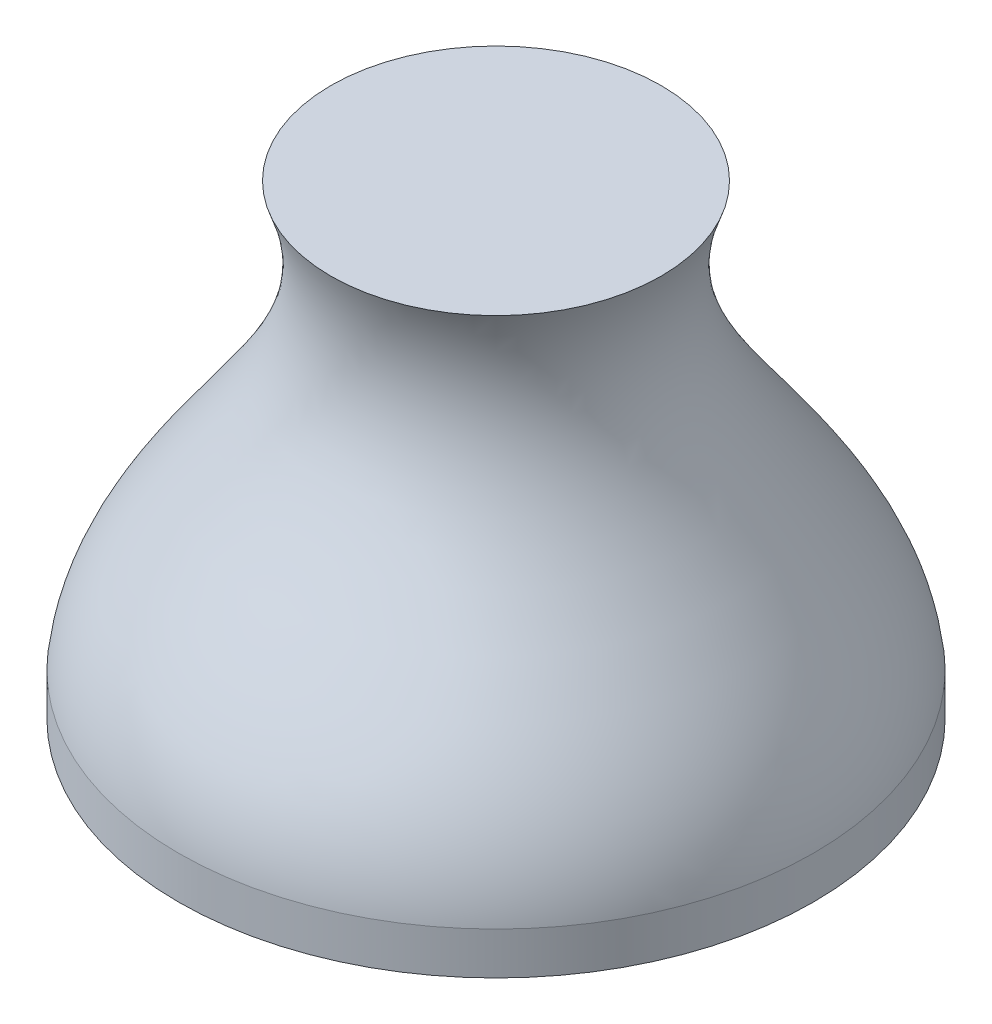
ISO-10303-21;
HEADER;
FILE_DESCRIPTION(('STEP AP214'),'2;1');
FILE_NAME('part.step','',(''),(''),'','','');
FILE_SCHEMA(('AUTOMOTIVE_DESIGN { 1 0 10303 214 1 1 1 1 }'));
ENDSEC;
DATA;
#1=APPLICATION_CONTEXT('core data for automotive mechanical design processes');
#2=APPLICATION_PROTOCOL_DEFINITION('international standard','automotive_design',2000,#1);
#3=PRODUCT_CONTEXT('',#1,'mechanical');
#4=PRODUCT('Part','Part','',(#3));
#5=PRODUCT_RELATED_PRODUCT_CATEGORY('part','',(#4));
#6=PRODUCT_DEFINITION_FORMATION('','',#4);
#7=PRODUCT_DEFINITION_CONTEXT('part definition',#1,'design');
#8=PRODUCT_DEFINITION('design','',#6,#7);
#9=PRODUCT_DEFINITION_SHAPE('','',#8);
#10=(LENGTH_UNIT() NAMED_UNIT(*) SI_UNIT(.MILLI.,.METRE.));
#11=(NAMED_UNIT(*) PLANE_ANGLE_UNIT() SI_UNIT($,.RADIAN.));
#12=(NAMED_UNIT(*) SI_UNIT($,.STERADIAN.) SOLID_ANGLE_UNIT());
#13=UNCERTAINTY_MEASURE_WITH_UNIT(LENGTH_MEASURE(1.E-05),#10,'distance_accuracy_value','');
#14=(GEOMETRIC_REPRESENTATION_CONTEXT(3) GLOBAL_UNCERTAINTY_ASSIGNED_CONTEXT((#13)) GLOBAL_UNIT_ASSIGNED_CONTEXT((#10,
#11,#12)) REPRESENTATION_CONTEXT('',''));
#15=CARTESIAN_POINT('',(0.,0.,0.));
#16=DIRECTION('',(0.,0.,1.));
#17=DIRECTION('',(1.,0.,0.));
#18=AXIS2_PLACEMENT_3D('',#15,#16,#17);
#19=CARTESIAN_POINT('',(0.,20.,0.));
#20=DIRECTION('',(0.,1.,0.));
#21=DIRECTION('',(0.,0.,1.));
#22=AXIS2_PLACEMENT_3D('',#19,#20,#21);
#23=PLANE('',#22);
#24=CARTESIAN_POINT('',(0.,20.,0.));
#25=DIRECTION('',(0.,-1.,0.));
#26=DIRECTION('',(0.,0.,-1.));
#27=AXIS2_PLACEMENT_3D('',#24,#25,#26);
#28=CIRCLE('',#27,7.79946678747429);
#29=CARTESIAN_POINT('',(0.,20.,-7.79946678747429));
#30=VERTEX_POINT('',#29);
#31=EDGE_CURVE('E10',#30,#30,#28,.T.);
#32=ORIENTED_EDGE('',*,*,#31,.F.);
#33=EDGE_LOOP('',(#32));
#34=FACE_BOUND('',#33,.T.);
#35=ADVANCED_FACE('F43',(#34),#23,.T.);
#36=CARTESIAN_POINT('',(15.,0.,0.));
#37=CARTESIAN_POINT('',(14.1432791096964,7.42030353401986,0.));
#38=CARTESIAN_POINT('',(4.50256170609478,11.6925361738555,0.));
#39=CARTESIAN_POINT('',(7.79946678747429,20.,0.));
#40=B_SPLINE_CURVE_WITH_KNOTS('',3,(#36,#37,#38,#39),.UNSPECIFIED.,.F.,.F.,(4,4),(0.,1.),.UNSPECIFIED.);
#41=CARTESIAN_POINT('',(0.,0.,0.));
#42=DIRECTION('',(0.,-1.,0.));
#43=AXIS1_PLACEMENT('',#41,#42);
#44=SURFACE_OF_REVOLUTION('',#40,#43);
#45=ORIENTED_EDGE('',*,*,#31,.T.);
#46=EDGE_LOOP('',(#45));
#47=FACE_BOUND('',#46,.T.);
#48=CARTESIAN_POINT('',(0.,0.,0.));
#49=DIRECTION('',(0.,-1.,0.));
#50=DIRECTION('',(0.,0.,-1.));
#51=AXIS2_PLACEMENT_3D('',#48,#49,#50);
#52=CIRCLE('',#51,15.);
#53=CARTESIAN_POINT('',(0.,0.,-15.));
#54=VERTEX_POINT('',#53);
#55=EDGE_CURVE('E50',#54,#54,#52,.T.);
#56=ORIENTED_EDGE('',*,*,#55,.F.);
#57=EDGE_LOOP('',(#56));
#58=FACE_BOUND('',#57,.T.);
#59=ADVANCED_FACE('F68',(#47,#58),#44,.F.);
#60=CARTESIAN_POINT('',(0.,-2.,0.));
#61=DIRECTION('',(0.,1.,0.));
#62=DIRECTION('',(0.,0.,1.));
#63=AXIS2_PLACEMENT_3D('',#60,#61,#62);
#64=CYLINDRICAL_SURFACE('',#63,15.);
#65=CARTESIAN_POINT('',(0.,-2.,0.));
#66=DIRECTION('',(0.,-1.,0.));
#67=DIRECTION('',(0.,0.,-1.));
#68=AXIS2_PLACEMENT_3D('',#65,#66,#67);
#69=CIRCLE('',#68,15.);
#70=CARTESIAN_POINT('',(0.,-2.,-15.));
#71=VERTEX_POINT('',#70);
#72=EDGE_CURVE('E55',#71,#71,#69,.T.);
#73=ORIENTED_EDGE('',*,*,#72,.F.);
#74=EDGE_LOOP('',(#73));
#75=FACE_BOUND('',#74,.T.);
#76=ORIENTED_EDGE('',*,*,#55,.T.);
#77=EDGE_LOOP('',(#76));
#78=FACE_BOUND('',#77,.T.);
#79=ADVANCED_FACE('F71',(#75,#78),#64,.T.);
#80=CARTESIAN_POINT('',(0.,-2.,0.));
#81=DIRECTION('',(0.,-1.,0.));
#82=DIRECTION('',(0.,0.,-1.));
#83=AXIS2_PLACEMENT_3D('',#80,#81,#82);
#84=PLANE('',#83);
#85=ORIENTED_EDGE('',*,*,#72,.T.);
#86=EDGE_LOOP('',(#85));
#87=FACE_BOUND('',#86,.T.);
#88=ADVANCED_FACE('F74',(#87),#84,.T.);
#89=CLOSED_SHELL('',(#35,#59,#79,#88));
#90=MANIFOLD_SOLID_BREP('B2',#89);
#91=ADVANCED_BREP_SHAPE_REPRESENTATION('',(#18,#90),#14);
#92=SHAPE_DEFINITION_REPRESENTATION(#9,#91);
ENDSEC;
END-ISO-10303-21;
